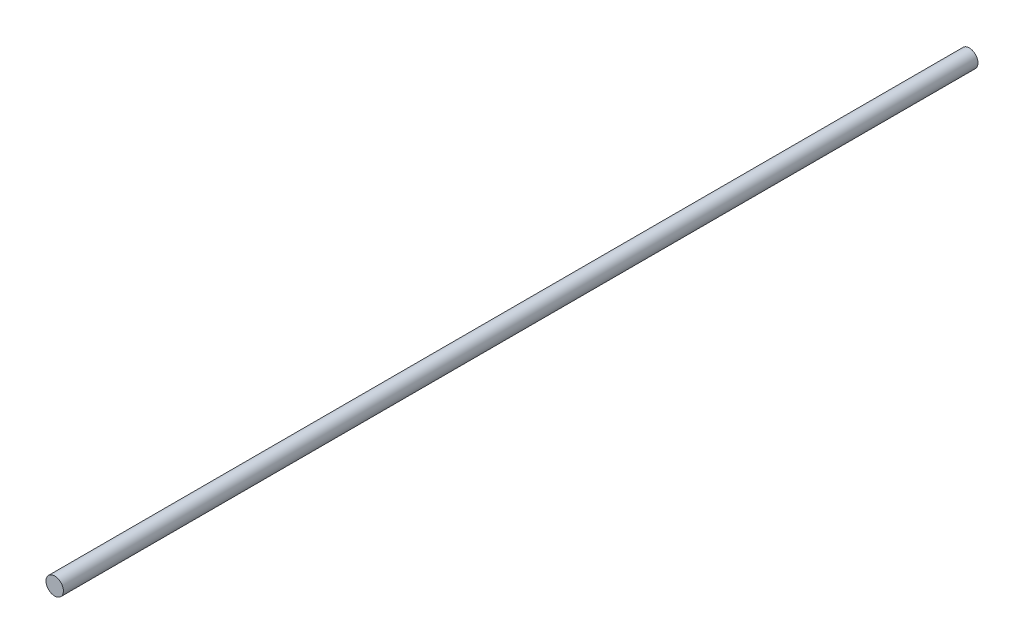
ISO-10303-21;
HEADER;
FILE_DESCRIPTION(('STEP AP214'),'2;1');
FILE_NAME('part.step','',(''),(''),'','','');
FILE_SCHEMA(('AUTOMOTIVE_DESIGN { 1 0 10303 214 1 1 1 1 }'));
ENDSEC;
DATA;
#1=APPLICATION_CONTEXT('core data for automotive mechanical design processes');
#2=APPLICATION_PROTOCOL_DEFINITION('international standard','automotive_design',2000,#1);
#3=PRODUCT_CONTEXT('',#1,'mechanical');
#4=PRODUCT('Part','Part','',(#3));
#5=PRODUCT_RELATED_PRODUCT_CATEGORY('part','',(#4));
#6=PRODUCT_DEFINITION_FORMATION('','',#4);
#7=PRODUCT_DEFINITION_CONTEXT('part definition',#1,'design');
#8=PRODUCT_DEFINITION('design','',#6,#7);
#9=PRODUCT_DEFINITION_SHAPE('','',#8);
#10=(LENGTH_UNIT() NAMED_UNIT(*) SI_UNIT(.MILLI.,.METRE.));
#11=(NAMED_UNIT(*) PLANE_ANGLE_UNIT() SI_UNIT($,.RADIAN.));
#12=(NAMED_UNIT(*) SI_UNIT($,.STERADIAN.) SOLID_ANGLE_UNIT());
#13=UNCERTAINTY_MEASURE_WITH_UNIT(LENGTH_MEASURE(1.E-05),#10,'distance_accuracy_value','');
#14=(GEOMETRIC_REPRESENTATION_CONTEXT(3) GLOBAL_UNCERTAINTY_ASSIGNED_CONTEXT((#13)) GLOBAL_UNIT_ASSIGNED_CONTEXT((#10,
#11,#12)) REPRESENTATION_CONTEXT('',''));
#15=CARTESIAN_POINT('',(0.,0.,0.));
#16=DIRECTION('',(0.,0.,1.));
#17=DIRECTION('',(1.,0.,0.));
#18=AXIS2_PLACEMENT_3D('',#15,#16,#17);
#19=CARTESIAN_POINT('',(0.,0.,2100.));
#20=DIRECTION('',(0.,0.,-1.));
#21=DIRECTION('',(-1.,0.,0.));
#22=AXIS2_PLACEMENT_3D('',#19,#20,#21);
#23=CYLINDRICAL_SURFACE('',#22,20.);
#24=CARTESIAN_POINT('',(0.,0.,2100.));
#25=DIRECTION('',(0.,0.,1.));
#26=DIRECTION('',(1.,0.,0.));
#27=AXIS2_PLACEMENT_3D('',#24,#25,#26);
#28=CIRCLE('',#27,20.);
#29=CARTESIAN_POINT('',(20.,0.,2100.));
#30=VERTEX_POINT('',#29);
#31=EDGE_CURVE('E10',#30,#30,#28,.T.);
#32=ORIENTED_EDGE('',*,*,#31,.F.);
#33=EDGE_LOOP('',(#32));
#34=FACE_BOUND('',#33,.T.);
#35=CARTESIAN_POINT('',(0.,0.,0.));
#36=DIRECTION('',(0.,0.,1.));
#37=DIRECTION('',(1.,0.,0.));
#38=AXIS2_PLACEMENT_3D('',#35,#36,#37);
#39=CIRCLE('',#38,20.);
#40=CARTESIAN_POINT('',(20.,0.,0.));
#41=VERTEX_POINT('',#40);
#42=EDGE_CURVE('E33',#41,#41,#39,.T.);
#43=ORIENTED_EDGE('',*,*,#42,.T.);
#44=EDGE_LOOP('',(#43));
#45=FACE_BOUND('',#44,.T.);
#46=ADVANCED_FACE('F30',(#34,#45),#23,.T.);
#47=CARTESIAN_POINT('',(0.,0.,2100.));
#48=DIRECTION('',(0.,0.,1.));
#49=DIRECTION('',(1.,0.,0.));
#50=AXIS2_PLACEMENT_3D('',#47,#48,#49);
#51=PLANE('',#50);
#52=ORIENTED_EDGE('',*,*,#31,.T.);
#53=EDGE_LOOP('',(#52));
#54=FACE_BOUND('',#53,.T.);
#55=ADVANCED_FACE('F45',(#54),#51,.T.);
#56=CARTESIAN_POINT('',(0.,0.,0.));
#57=DIRECTION('',(0.,0.,1.));
#58=DIRECTION('',(1.,0.,0.));
#59=AXIS2_PLACEMENT_3D('',#56,#57,#58);
#60=PLANE('',#59);
#61=ORIENTED_EDGE('',*,*,#42,.F.);
#62=EDGE_LOOP('',(#61));
#63=FACE_BOUND('',#62,.T.);
#64=ADVANCED_FACE('F43',(#63),#60,.F.);
#65=CLOSED_SHELL('',(#46,#55,#64));
#66=MANIFOLD_SOLID_BREP('B2',#65);
#67=ADVANCED_BREP_SHAPE_REPRESENTATION('',(#18,#66),#14);
#68=SHAPE_DEFINITION_REPRESENTATION(#9,#67);
ENDSEC;
END-ISO-10303-21;
